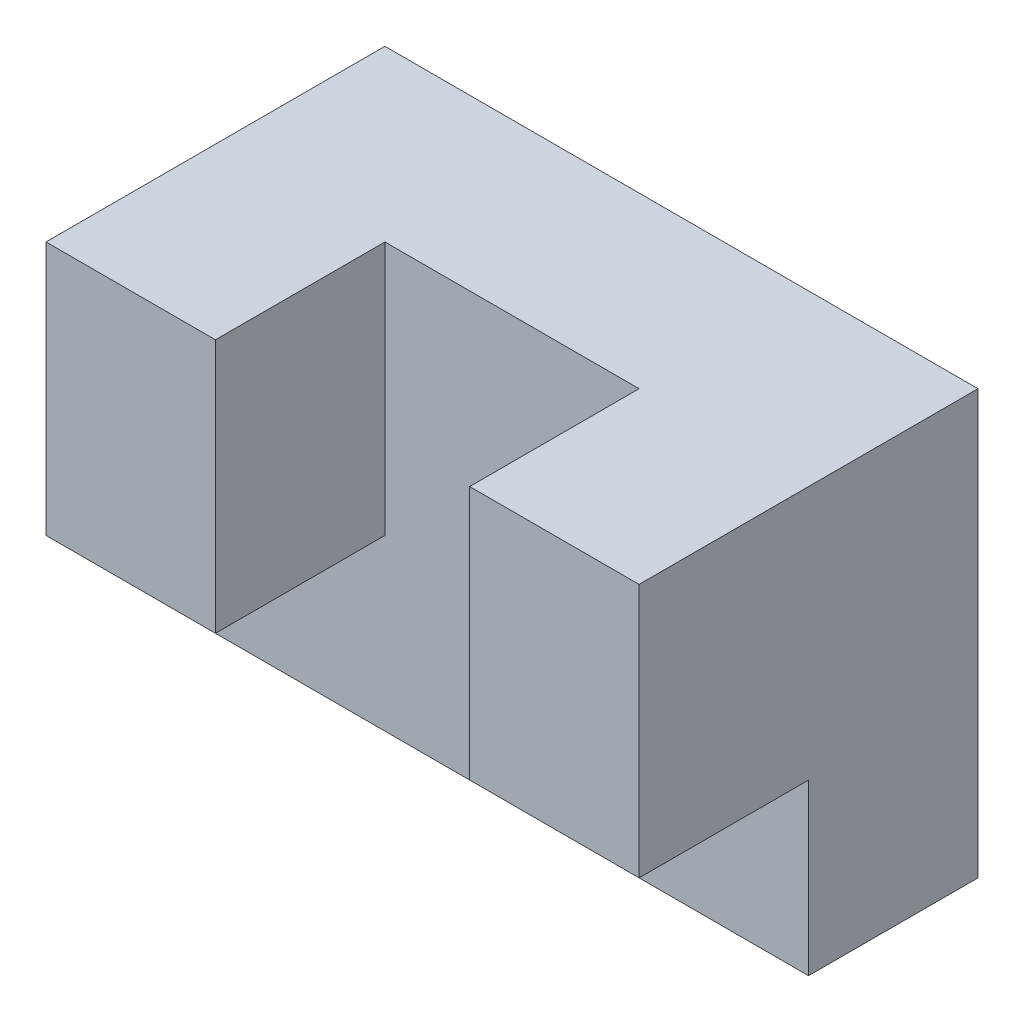
ISO-10303-21;
HEADER;
FILE_DESCRIPTION(('STEP AP214'),'2;1');
FILE_NAME('part.step','',(''),(''),'','','');
FILE_SCHEMA(('AUTOMOTIVE_DESIGN { 1 0 10303 214 1 1 1 1 }'));
ENDSEC;
DATA;
#1=APPLICATION_CONTEXT('core data for automotive mechanical design processes');
#2=APPLICATION_PROTOCOL_DEFINITION('international standard','automotive_design',2000,#1);
#3=PRODUCT_CONTEXT('',#1,'mechanical');
#4=PRODUCT('Part','Part','',(#3));
#5=PRODUCT_RELATED_PRODUCT_CATEGORY('part','',(#4));
#6=PRODUCT_DEFINITION_FORMATION('','',#4);
#7=PRODUCT_DEFINITION_CONTEXT('part definition',#1,'design');
#8=PRODUCT_DEFINITION('design','',#6,#7);
#9=PRODUCT_DEFINITION_SHAPE('','',#8);
#10=(LENGTH_UNIT() NAMED_UNIT(*) SI_UNIT(.MILLI.,.METRE.));
#11=(NAMED_UNIT(*) PLANE_ANGLE_UNIT() SI_UNIT($,.RADIAN.));
#12=(NAMED_UNIT(*) SI_UNIT($,.STERADIAN.) SOLID_ANGLE_UNIT());
#13=UNCERTAINTY_MEASURE_WITH_UNIT(LENGTH_MEASURE(1.E-05),#10,'distance_accuracy_value','');
#14=(GEOMETRIC_REPRESENTATION_CONTEXT(3) GLOBAL_UNCERTAINTY_ASSIGNED_CONTEXT((#13)) GLOBAL_UNIT_ASSIGNED_CONTEXT((#10,
#11,#12)) REPRESENTATION_CONTEXT('',''));
#15=CARTESIAN_POINT('',(0.,0.,0.));
#16=DIRECTION('',(0.,0.,1.));
#17=DIRECTION('',(1.,0.,0.));
#18=AXIS2_PLACEMENT_3D('',#15,#16,#17);
#19=CARTESIAN_POINT('',(0.,0.,20.));
#20=DIRECTION('',(0.,0.,-1.));
#21=DIRECTION('',(-1.,0.,0.));
#22=AXIS2_PLACEMENT_3D('',#19,#20,#21);
#23=PLANE('',#22);
#24=DIRECTION('',(0.,-1.,0.));
#25=VECTOR('',#24,1.);
#26=CARTESIAN_POINT('',(15.,25.,20.));
#27=LINE('',#26,#25);
#28=CARTESIAN_POINT('',(15.,25.,20.));
#29=VERTEX_POINT('',#28);
#30=CARTESIAN_POINT('',(15.,-5.,20.));
#31=VERTEX_POINT('',#30);
#32=EDGE_CURVE('E131',#29,#31,#27,.T.);
#33=ORIENTED_EDGE('',*,*,#32,.F.);
#34=DIRECTION('',(-1.,0.,0.));
#35=VECTOR('',#34,1.);
#36=CARTESIAN_POINT('',(-35.,25.,20.));
#37=LINE('',#36,#35);
#38=CARTESIAN_POINT('',(-15.,25.,20.));
#39=VERTEX_POINT('',#38);
#40=EDGE_CURVE('E169',#29,#39,#37,.T.);
#41=ORIENTED_EDGE('',*,*,#40,.T.);
#42=DIRECTION('',(0.,1.,0.));
#43=VECTOR('',#42,1.);
#44=CARTESIAN_POINT('',(-15.,25.,20.));
#45=LINE('',#44,#43);
#46=CARTESIAN_POINT('',(-15.,-5.,20.));
#47=VERTEX_POINT('',#46);
#48=EDGE_CURVE('E148',#47,#39,#45,.T.);
#49=ORIENTED_EDGE('',*,*,#48,.F.);
#50=DIRECTION('',(1.,0.,0.));
#51=VECTOR('',#50,1.);
#52=CARTESIAN_POINT('',(-35.,-5.,20.));
#53=LINE('',#52,#51);
#54=CARTESIAN_POINT('',(-35.,-5.,20.));
#55=VERTEX_POINT('',#54);
#56=EDGE_CURVE('E143',#55,#47,#53,.T.);
#57=ORIENTED_EDGE('',*,*,#56,.F.);
#58=DIRECTION('',(0.,-1.,0.));
#59=VECTOR('',#58,1.);
#60=CARTESIAN_POINT('',(-35.,-25.,20.));
#61=LINE('',#60,#59);
#62=CARTESIAN_POINT('',(-35.,-25.,20.));
#63=VERTEX_POINT('',#62);
#64=EDGE_CURVE('E172',#55,#63,#61,.T.);
#65=ORIENTED_EDGE('',*,*,#64,.T.);
#66=DIRECTION('',(1.,0.,0.));
#67=VECTOR('',#66,1.);
#68=CARTESIAN_POINT('',(-35.,-25.,20.));
#69=LINE('',#68,#67);
#70=CARTESIAN_POINT('',(35.,-25.,20.));
#71=VERTEX_POINT('',#70);
#72=EDGE_CURVE('E174',#63,#71,#69,.T.);
#73=ORIENTED_EDGE('',*,*,#72,.T.);
#74=DIRECTION('',(0.,1.,0.));
#75=VECTOR('',#74,1.);
#76=CARTESIAN_POINT('',(35.,-25.,20.));
#77=LINE('',#76,#75);
#78=CARTESIAN_POINT('',(35.,-5.,20.));
#79=VERTEX_POINT('',#78);
#80=EDGE_CURVE('E53',#71,#79,#77,.T.);
#81=ORIENTED_EDGE('',*,*,#80,.T.);
#82=DIRECTION('',(1.,0.,0.));
#83=VECTOR('',#82,1.);
#84=CARTESIAN_POINT('',(35.,-5.,20.));
#85=LINE('',#84,#83);
#86=EDGE_CURVE('E48',#31,#79,#85,.T.);
#87=ORIENTED_EDGE('',*,*,#86,.F.);
#88=EDGE_LOOP('',(#33,#41,#49,#57,#65,#73,#81,#87));
#89=FACE_BOUND('',#88,.T.);
#90=ADVANCED_FACE('F33',(#89),#23,.F.);
#91=CARTESIAN_POINT('',(35.,-25.,20.));
#92=DIRECTION('',(-1.,0.,0.));
#93=DIRECTION('',(0.,0.,1.));
#94=AXIS2_PLACEMENT_3D('',#91,#92,#93);
#95=PLANE('',#94);
#96=DIRECTION('',(0.,1.,0.));
#97=VECTOR('',#96,1.);
#98=CARTESIAN_POINT('',(35.,-25.,0.));
#99=LINE('',#98,#97);
#100=CARTESIAN_POINT('',(35.,-25.,0.));
#101=VERTEX_POINT('',#100);
#102=CARTESIAN_POINT('',(35.,25.,0.));
#103=VERTEX_POINT('',#102);
#104=EDGE_CURVE('E115',#101,#103,#99,.T.);
#105=ORIENTED_EDGE('',*,*,#104,.T.);
#106=DIRECTION('',(0.,0.,-1.));
#107=VECTOR('',#106,1.);
#108=CARTESIAN_POINT('',(35.,25.,20.));
#109=LINE('',#108,#107);
#110=CARTESIAN_POINT('',(35.,25.,40.));
#111=VERTEX_POINT('',#110);
#112=EDGE_CURVE('E11',#111,#103,#109,.T.);
#113=ORIENTED_EDGE('',*,*,#112,.F.);
#114=DIRECTION('',(0.,1.,0.));
#115=VECTOR('',#114,1.);
#116=CARTESIAN_POINT('',(35.,25.,40.));
#117=LINE('',#116,#115);
#118=CARTESIAN_POINT('',(35.,-5.,40.));
#119=VERTEX_POINT('',#118);
#120=EDGE_CURVE('E112',#119,#111,#117,.T.);
#121=ORIENTED_EDGE('',*,*,#120,.F.);
#122=DIRECTION('',(0.,0.,-1.));
#123=VECTOR('',#122,1.);
#124=CARTESIAN_POINT('',(35.,-5.,40.));
#125=LINE('',#124,#123);
#126=EDGE_CURVE('E136',#119,#79,#125,.T.);
#127=ORIENTED_EDGE('',*,*,#126,.T.);
#128=ORIENTED_EDGE('',*,*,#80,.F.);
#129=DIRECTION('',(0.,0.,-1.));
#130=VECTOR('',#129,1.);
#131=CARTESIAN_POINT('',(35.,-25.,20.));
#132=LINE('',#131,#130);
#133=EDGE_CURVE('E176',#71,#101,#132,.T.);
#134=ORIENTED_EDGE('',*,*,#133,.T.);
#135=EDGE_LOOP('',(#105,#113,#121,#127,#128,#134));
#136=FACE_BOUND('',#135,.T.);
#137=ADVANCED_FACE('F35',(#136),#95,.F.);
#138=CARTESIAN_POINT('',(-35.,25.,20.));
#139=DIRECTION('',(0.,-1.,0.));
#140=DIRECTION('',(0.,0.,-1.));
#141=AXIS2_PLACEMENT_3D('',#138,#139,#140);
#142=PLANE('',#141);
#143=DIRECTION('',(-1.,0.,0.));
#144=VECTOR('',#143,1.);
#145=CARTESIAN_POINT('',(-35.,25.,0.));
#146=LINE('',#145,#144);
#147=CARTESIAN_POINT('',(-35.,25.,0.));
#148=VERTEX_POINT('',#147);
#149=EDGE_CURVE('E178',#103,#148,#146,.T.);
#150=ORIENTED_EDGE('',*,*,#149,.T.);
#151=DIRECTION('',(0.,0.,-1.));
#152=VECTOR('',#151,1.);
#153=CARTESIAN_POINT('',(-35.,25.,20.));
#154=LINE('',#153,#152);
#155=CARTESIAN_POINT('',(-35.,25.,40.));
#156=VERTEX_POINT('',#155);
#157=EDGE_CURVE('E41',#156,#148,#154,.T.);
#158=ORIENTED_EDGE('',*,*,#157,.F.);
#159=DIRECTION('',(-1.,0.,0.));
#160=VECTOR('',#159,1.);
#161=CARTESIAN_POINT('',(-35.,25.,40.));
#162=LINE('',#161,#160);
#163=CARTESIAN_POINT('',(-15.,25.,40.));
#164=VERTEX_POINT('',#163);
#165=EDGE_CURVE('E152',#164,#156,#162,.T.);
#166=ORIENTED_EDGE('',*,*,#165,.F.);
#167=DIRECTION('',(0.,0.,-1.));
#168=VECTOR('',#167,1.);
#169=CARTESIAN_POINT('',(-15.,25.,40.));
#170=LINE('',#169,#168);
#171=EDGE_CURVE('E155',#164,#39,#170,.T.);
#172=ORIENTED_EDGE('',*,*,#171,.T.);
#173=ORIENTED_EDGE('',*,*,#40,.F.);
#174=DIRECTION('',(0.,0.,-1.));
#175=VECTOR('',#174,1.);
#176=CARTESIAN_POINT('',(15.,25.,40.));
#177=LINE('',#176,#175);
#178=CARTESIAN_POINT('',(15.,25.,40.));
#179=VERTEX_POINT('',#178);
#180=EDGE_CURVE('E121',#179,#29,#177,.T.);
#181=ORIENTED_EDGE('',*,*,#180,.F.);
#182=DIRECTION('',(-1.,0.,0.));
#183=VECTOR('',#182,1.);
#184=CARTESIAN_POINT('',(35.,25.,40.));
#185=LINE('',#184,#183);
#186=EDGE_CURVE('E118',#111,#179,#185,.T.);
#187=ORIENTED_EDGE('',*,*,#186,.F.);
#188=ORIENTED_EDGE('',*,*,#112,.T.);
#189=EDGE_LOOP('',(#150,#158,#166,#172,#173,#181,#187,#188));
#190=FACE_BOUND('',#189,.T.);
#191=ADVANCED_FACE('F119',(#190),#142,.F.);
#192=CARTESIAN_POINT('',(-35.,-25.,20.));
#193=DIRECTION('',(1.,0.,0.));
#194=DIRECTION('',(0.,0.,-1.));
#195=AXIS2_PLACEMENT_3D('',#192,#193,#194);
#196=PLANE('',#195);
#197=DIRECTION('',(0.,-1.,0.));
#198=VECTOR('',#197,1.);
#199=CARTESIAN_POINT('',(-35.,-25.,0.));
#200=LINE('',#199,#198);
#201=CARTESIAN_POINT('',(-35.,-25.,0.));
#202=VERTEX_POINT('',#201);
#203=EDGE_CURVE('E180',#148,#202,#200,.T.);
#204=ORIENTED_EDGE('',*,*,#203,.T.);
#205=DIRECTION('',(0.,0.,-1.));
#206=VECTOR('',#205,1.);
#207=CARTESIAN_POINT('',(-35.,-25.,20.));
#208=LINE('',#207,#206);
#209=EDGE_CURVE('E184',#63,#202,#208,.T.);
#210=ORIENTED_EDGE('',*,*,#209,.F.);
#211=ORIENTED_EDGE('',*,*,#64,.F.);
#212=DIRECTION('',(0.,0.,-1.));
#213=VECTOR('',#212,1.);
#214=CARTESIAN_POINT('',(-35.,-5.,40.));
#215=LINE('',#214,#213);
#216=CARTESIAN_POINT('',(-35.,-5.,40.));
#217=VERTEX_POINT('',#216);
#218=EDGE_CURVE('E165',#217,#55,#215,.T.);
#219=ORIENTED_EDGE('',*,*,#218,.F.);
#220=DIRECTION('',(0.,-1.,0.));
#221=VECTOR('',#220,1.);
#222=CARTESIAN_POINT('',(-35.,25.,40.));
#223=LINE('',#222,#221);
#224=EDGE_CURVE('E144',#156,#217,#223,.T.);
#225=ORIENTED_EDGE('',*,*,#224,.F.);
#226=ORIENTED_EDGE('',*,*,#157,.T.);
#227=EDGE_LOOP('',(#204,#210,#211,#219,#225,#226));
#228=FACE_BOUND('',#227,.T.);
#229=ADVANCED_FACE('F190',(#228),#196,.F.);
#230=CARTESIAN_POINT('',(-35.,-25.,20.));
#231=DIRECTION('',(0.,1.,0.));
#232=DIRECTION('',(0.,0.,1.));
#233=AXIS2_PLACEMENT_3D('',#230,#231,#232);
#234=PLANE('',#233);
#235=DIRECTION('',(1.,0.,0.));
#236=VECTOR('',#235,1.);
#237=CARTESIAN_POINT('',(-35.,-25.,0.));
#238=LINE('',#237,#236);
#239=EDGE_CURVE('E170',#202,#101,#238,.T.);
#240=ORIENTED_EDGE('',*,*,#239,.T.);
#241=ORIENTED_EDGE('',*,*,#133,.F.);
#242=ORIENTED_EDGE('',*,*,#72,.F.);
#243=ORIENTED_EDGE('',*,*,#209,.T.);
#244=EDGE_LOOP('',(#240,#241,#242,#243));
#245=FACE_BOUND('',#244,.T.);
#246=ADVANCED_FACE('F199',(#245),#234,.F.);
#247=CARTESIAN_POINT('',(0.,0.,0.));
#248=DIRECTION('',(0.,0.,-1.));
#249=DIRECTION('',(-1.,0.,0.));
#250=AXIS2_PLACEMENT_3D('',#247,#248,#249);
#251=PLANE('',#250);
#252=ORIENTED_EDGE('',*,*,#104,.F.);
#253=ORIENTED_EDGE('',*,*,#239,.F.);
#254=ORIENTED_EDGE('',*,*,#203,.F.);
#255=ORIENTED_EDGE('',*,*,#149,.F.);
#256=EDGE_LOOP('',(#252,#253,#254,#255));
#257=FACE_BOUND('',#256,.T.);
#258=ADVANCED_FACE('F196',(#257),#251,.T.);
#259=CARTESIAN_POINT('',(-35.,-5.,40.));
#260=DIRECTION('',(0.,1.,0.));
#261=DIRECTION('',(0.,0.,1.));
#262=AXIS2_PLACEMENT_3D('',#259,#260,#261);
#263=PLANE('',#262);
#264=ORIENTED_EDGE('',*,*,#56,.T.);
#265=DIRECTION('',(0.,0.,-1.));
#266=VECTOR('',#265,1.);
#267=CARTESIAN_POINT('',(-15.,-5.,40.));
#268=LINE('',#267,#266);
#269=CARTESIAN_POINT('',(-15.,-5.,40.));
#270=VERTEX_POINT('',#269);
#271=EDGE_CURVE('E162',#270,#47,#268,.T.);
#272=ORIENTED_EDGE('',*,*,#271,.F.);
#273=DIRECTION('',(1.,0.,0.));
#274=VECTOR('',#273,1.);
#275=CARTESIAN_POINT('',(-35.,-5.,40.));
#276=LINE('',#275,#274);
#277=EDGE_CURVE('E147',#217,#270,#276,.T.);
#278=ORIENTED_EDGE('',*,*,#277,.F.);
#279=ORIENTED_EDGE('',*,*,#218,.T.);
#280=EDGE_LOOP('',(#264,#272,#278,#279));
#281=FACE_BOUND('',#280,.T.);
#282=ADVANCED_FACE('F214',(#281),#263,.F.);
#283=CARTESIAN_POINT('',(-15.,25.,40.));
#284=DIRECTION('',(-1.,0.,0.));
#285=DIRECTION('',(0.,-1.,0.));
#286=AXIS2_PLACEMENT_3D('',#283,#284,#285);
#287=PLANE('',#286);
#288=ORIENTED_EDGE('',*,*,#48,.T.);
#289=ORIENTED_EDGE('',*,*,#171,.F.);
#290=DIRECTION('',(0.,1.,0.));
#291=VECTOR('',#290,1.);
#292=CARTESIAN_POINT('',(-15.,25.,40.));
#293=LINE('',#292,#291);
#294=EDGE_CURVE('E150',#270,#164,#293,.T.);
#295=ORIENTED_EDGE('',*,*,#294,.F.);
#296=ORIENTED_EDGE('',*,*,#271,.T.);
#297=EDGE_LOOP('',(#288,#289,#295,#296));
#298=FACE_BOUND('',#297,.T.);
#299=ADVANCED_FACE('F208',(#298),#287,.F.);
#300=CARTESIAN_POINT('',(0.,0.,40.));
#301=DIRECTION('',(0.,0.,1.));
#302=DIRECTION('',(1.,0.,0.));
#303=AXIS2_PLACEMENT_3D('',#300,#301,#302);
#304=PLANE('',#303);
#305=ORIENTED_EDGE('',*,*,#224,.T.);
#306=ORIENTED_EDGE('',*,*,#277,.T.);
#307=ORIENTED_EDGE('',*,*,#294,.T.);
#308=ORIENTED_EDGE('',*,*,#165,.T.);
#309=EDGE_LOOP('',(#305,#306,#307,#308));
#310=FACE_BOUND('',#309,.T.);
#311=ADVANCED_FACE('F212',(#310),#304,.T.);
#312=CARTESIAN_POINT('',(15.,25.,40.));
#313=DIRECTION('',(1.,0.,0.));
#314=DIRECTION('',(0.,1.,0.));
#315=AXIS2_PLACEMENT_3D('',#312,#313,#314);
#316=PLANE('',#315);
#317=ORIENTED_EDGE('',*,*,#32,.T.);
#318=DIRECTION('',(0.,0.,-1.));
#319=VECTOR('',#318,1.);
#320=CARTESIAN_POINT('',(15.,-5.,40.));
#321=LINE('',#320,#319);
#322=CARTESIAN_POINT('',(15.,-5.,40.));
#323=VERTEX_POINT('',#322);
#324=EDGE_CURVE('E139',#323,#31,#321,.T.);
#325=ORIENTED_EDGE('',*,*,#324,.F.);
#326=DIRECTION('',(0.,-1.,0.));
#327=VECTOR('',#326,1.);
#328=CARTESIAN_POINT('',(15.,25.,40.));
#329=LINE('',#328,#327);
#330=EDGE_CURVE('E124',#179,#323,#329,.T.);
#331=ORIENTED_EDGE('',*,*,#330,.F.);
#332=ORIENTED_EDGE('',*,*,#180,.T.);
#333=EDGE_LOOP('',(#317,#325,#331,#332));
#334=FACE_BOUND('',#333,.T.);
#335=ADVANCED_FACE('F205',(#334),#316,.F.);
#336=CARTESIAN_POINT('',(35.,-5.,40.));
#337=DIRECTION('',(0.,1.,0.));
#338=DIRECTION('',(-1.,0.,0.));
#339=AXIS2_PLACEMENT_3D('',#336,#337,#338);
#340=PLANE('',#339);
#341=ORIENTED_EDGE('',*,*,#86,.T.);
#342=ORIENTED_EDGE('',*,*,#126,.F.);
#343=DIRECTION('',(1.,0.,0.));
#344=VECTOR('',#343,1.);
#345=CARTESIAN_POINT('',(35.,-5.,40.));
#346=LINE('',#345,#344);
#347=EDGE_CURVE('E128',#323,#119,#346,.T.);
#348=ORIENTED_EDGE('',*,*,#347,.F.);
#349=ORIENTED_EDGE('',*,*,#324,.T.);
#350=EDGE_LOOP('',(#341,#342,#348,#349));
#351=FACE_BOUND('',#350,.T.);
#352=ADVANCED_FACE('F202',(#351),#340,.F.);
#353=CARTESIAN_POINT('',(0.,0.,40.));
#354=DIRECTION('',(0.,0.,-1.));
#355=DIRECTION('',(-1.,0.,0.));
#356=AXIS2_PLACEMENT_3D('',#353,#354,#355);
#357=PLANE('',#356);
#358=ORIENTED_EDGE('',*,*,#120,.T.);
#359=ORIENTED_EDGE('',*,*,#186,.T.);
#360=ORIENTED_EDGE('',*,*,#330,.T.);
#361=ORIENTED_EDGE('',*,*,#347,.T.);
#362=EDGE_LOOP('',(#358,#359,#360,#361));
#363=FACE_BOUND('',#362,.T.);
#364=ADVANCED_FACE('F126',(#363),#357,.F.);
#365=CLOSED_SHELL('',(#90,#137,#191,#229,#246,#258,#282,#299,#311,#335,#352,#364));
#366=MANIFOLD_SOLID_BREP('B2',#365);
#367=ADVANCED_BREP_SHAPE_REPRESENTATION('',(#18,#366),#14);
#368=SHAPE_DEFINITION_REPRESENTATION(#9,#367);
ENDSEC;
END-ISO-10303-21;
